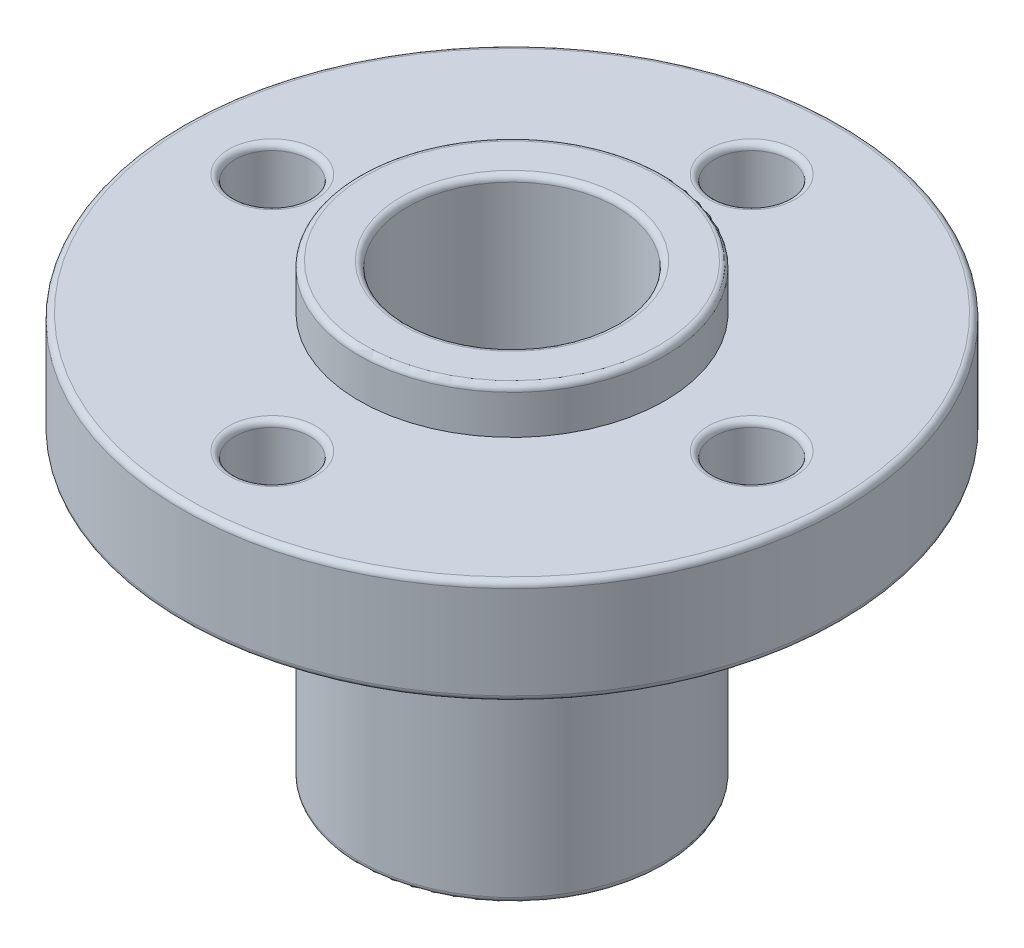
ISO-10303-21;
HEADER;
FILE_DESCRIPTION(('STEP AP214'),'2;1');
FILE_NAME('part.step','',(''),(''),'','','');
FILE_SCHEMA(('AUTOMOTIVE_DESIGN { 1 0 10303 214 1 1 1 1 }'));
ENDSEC;
DATA;
#1=APPLICATION_CONTEXT('core data for automotive mechanical design processes');
#2=APPLICATION_PROTOCOL_DEFINITION('international standard','automotive_design',2000,#1);
#3=PRODUCT_CONTEXT('',#1,'mechanical');
#4=PRODUCT('Part','Part','',(#3));
#5=PRODUCT_RELATED_PRODUCT_CATEGORY('part','',(#4));
#6=PRODUCT_DEFINITION_FORMATION('','',#4);
#7=PRODUCT_DEFINITION_CONTEXT('part definition',#1,'design');
#8=PRODUCT_DEFINITION('design','',#6,#7);
#9=PRODUCT_DEFINITION_SHAPE('','',#8);
#10=(LENGTH_UNIT() NAMED_UNIT(*) SI_UNIT(.MILLI.,.METRE.));
#11=(NAMED_UNIT(*) PLANE_ANGLE_UNIT() SI_UNIT($,.RADIAN.));
#12=(NAMED_UNIT(*) SI_UNIT($,.STERADIAN.) SOLID_ANGLE_UNIT());
#13=UNCERTAINTY_MEASURE_WITH_UNIT(LENGTH_MEASURE(1.E-05),#10,'distance_accuracy_value','');
#14=(GEOMETRIC_REPRESENTATION_CONTEXT(3) GLOBAL_UNCERTAINTY_ASSIGNED_CONTEXT((#13)) GLOBAL_UNIT_ASSIGNED_CONTEXT((#10,
#11,#12)) REPRESENTATION_CONTEXT('',''));
#15=CARTESIAN_POINT('',(0.,0.,0.));
#16=DIRECTION('',(0.,0.,1.));
#17=DIRECTION('',(1.,0.,0.));
#18=AXIS2_PLACEMENT_3D('',#15,#16,#17);
#19=CARTESIAN_POINT('',(5.1,1.74999999999999,0.));
#20=DIRECTION('',(0.,1.,0.));
#21=DIRECTION('',(-1.,0.,0.));
#22=AXIS2_PLACEMENT_3D('',#19,#20,#21);
#23=PLANE('',#22);
#24=CARTESIAN_POINT('',(-8.,1.74999999999995,0.));
#25=DIRECTION('',(0.,1.,0.));
#26=DIRECTION('',(-1.,0.,0.));
#27=AXIS2_PLACEMENT_3D('',#24,#25,#26);
#28=CIRCLE('',#27,1.45);
#29=CARTESIAN_POINT('',(-9.45,1.74999999999994,0.));
#30=VERTEX_POINT('',#29);
#31=EDGE_CURVE('E10',#30,#30,#28,.F.);
#32=ORIENTED_EDGE('',*,*,#31,.T.);
#33=EDGE_LOOP('',(#32));
#34=FACE_BOUND('',#33,.T.);
#35=CARTESIAN_POINT('',(0.,1.74999999999997,7.99999999999994));
#36=DIRECTION('',(0.,1.,0.));
#37=DIRECTION('',(-1.,0.,0.));
#38=AXIS2_PLACEMENT_3D('',#35,#36,#37);
#39=CIRCLE('',#38,1.45);
#40=CARTESIAN_POINT('',(-1.45,1.74999999999997,7.99999999999994));
#41=VERTEX_POINT('',#40);
#42=EDGE_CURVE('E41',#41,#41,#39,.F.);
#43=ORIENTED_EDGE('',*,*,#42,.T.);
#44=EDGE_LOOP('',(#43));
#45=FACE_BOUND('',#44,.T.);
#46=CARTESIAN_POINT('',(8.,1.75,0.));
#47=DIRECTION('',(0.,1.,0.));
#48=DIRECTION('',(-1.,0.,0.));
#49=AXIS2_PLACEMENT_3D('',#46,#47,#48);
#50=CIRCLE('',#49,1.45);
#51=CARTESIAN_POINT('',(6.55,1.75,0.));
#52=VERTEX_POINT('',#51);
#53=EDGE_CURVE('E45',#52,#52,#50,.F.);
#54=ORIENTED_EDGE('',*,*,#53,.T.);
#55=EDGE_LOOP('',(#54));
#56=FACE_BOUND('',#55,.T.);
#57=CARTESIAN_POINT('',(0.,1.74999999999997,-8.00000000000006));
#58=DIRECTION('',(0.,1.,0.));
#59=DIRECTION('',(-1.,0.,0.));
#60=AXIS2_PLACEMENT_3D('',#57,#58,#59);
#61=CIRCLE('',#60,1.45);
#62=CARTESIAN_POINT('',(-1.45,1.74999999999997,-8.00000000000006));
#63=VERTEX_POINT('',#62);
#64=EDGE_CURVE('E49',#63,#63,#61,.F.);
#65=ORIENTED_EDGE('',*,*,#64,.T.);
#66=EDGE_LOOP('',(#65));
#67=FACE_BOUND('',#66,.T.);
#68=CARTESIAN_POINT('',(0.,1.74999999999997,0.));
#69=DIRECTION('',(0.,-1.,0.));
#70=DIRECTION('',(1.,0.,0.));
#71=AXIS2_PLACEMENT_3D('',#68,#69,#70);
#72=CIRCLE('',#71,5.1);
#73=CARTESIAN_POINT('',(5.1,1.74999999999999,0.));
#74=VERTEX_POINT('',#73);
#75=EDGE_CURVE('E129',#74,#74,#72,.T.);
#76=ORIENTED_EDGE('',*,*,#75,.T.);
#77=EDGE_LOOP('',(#76));
#78=FACE_BOUND('',#77,.T.);
#79=CARTESIAN_POINT('',(0.,1.74999999999997,0.));
#80=DIRECTION('',(0.,-1.,0.));
#81=DIRECTION('',(1.,0.,0.));
#82=AXIS2_PLACEMENT_3D('',#79,#80,#81);
#83=CIRCLE('',#82,10.8);
#84=CARTESIAN_POINT('',(10.8,1.75000000000001,0.));
#85=VERTEX_POINT('',#84);
#86=EDGE_CURVE('E90',#85,#85,#83,.T.);
#87=ORIENTED_EDGE('',*,*,#86,.F.);
#88=EDGE_LOOP('',(#87));
#89=FACE_BOUND('',#88,.T.);
#90=ADVANCED_FACE('F34',(#34,#45,#56,#67,#78,#89),#23,.T.);
#91=CARTESIAN_POINT('',(0.,1.54999999999997,0.));
#92=DIRECTION('',(0.,-1.,0.));
#93=DIRECTION('',(1.,0.,0.));
#94=AXIS2_PLACEMENT_3D('',#91,#92,#93);
#95=TOROIDAL_SURFACE('',#94,10.8,0.199999999999998);
#96=ORIENTED_EDGE('',*,*,#86,.T.);
#97=EDGE_LOOP('',(#96));
#98=FACE_BOUND('',#97,.T.);
#99=CARTESIAN_POINT('',(0.,1.54999999999997,0.));
#100=DIRECTION('',(0.,-1.,0.));
#101=DIRECTION('',(1.,0.,0.));
#102=AXIS2_PLACEMENT_3D('',#99,#100,#101);
#103=CIRCLE('',#102,11.);
#104=CARTESIAN_POINT('',(11.,1.55000000000001,0.));
#105=VERTEX_POINT('',#104);
#106=EDGE_CURVE('E93',#105,#105,#103,.T.);
#107=ORIENTED_EDGE('',*,*,#106,.F.);
#108=EDGE_LOOP('',(#107));
#109=FACE_BOUND('',#108,.T.);
#110=ADVANCED_FACE('F152',(#98,#109),#95,.T.);
#111=CARTESIAN_POINT('',(7.33830190770167E-13,-213.929131969293,0.));
#112=DIRECTION('',(0.,-1.,0.));
#113=DIRECTION('',(1.,0.,0.));
#114=AXIS2_PLACEMENT_3D('',#111,#112,#113);
#115=CYLINDRICAL_SURFACE('',#114,11.);
#116=ORIENTED_EDGE('',*,*,#106,.T.);
#117=EDGE_LOOP('',(#116));
#118=FACE_BOUND('',#117,.T.);
#119=CARTESIAN_POINT('',(0.,-1.55000000000002,0.));
#120=DIRECTION('',(0.,-1.,0.));
#121=DIRECTION('',(1.,0.,0.));
#122=AXIS2_PLACEMENT_3D('',#119,#120,#121);
#123=CIRCLE('',#122,11.);
#124=CARTESIAN_POINT('',(11.,-1.54999999999999,0.));
#125=VERTEX_POINT('',#124);
#126=EDGE_CURVE('E96',#125,#125,#123,.T.);
#127=ORIENTED_EDGE('',*,*,#126,.F.);
#128=EDGE_LOOP('',(#127));
#129=FACE_BOUND('',#128,.T.);
#130=ADVANCED_FACE('F157',(#118,#129),#115,.T.);
#131=CARTESIAN_POINT('',(0.,-1.55000000000003,0.));
#132=DIRECTION('',(0.,-1.,0.));
#133=DIRECTION('',(1.,0.,0.));
#134=AXIS2_PLACEMENT_3D('',#131,#132,#133);
#135=TOROIDAL_SURFACE('',#134,10.8,0.199999999999998);
#136=ORIENTED_EDGE('',*,*,#126,.T.);
#137=EDGE_LOOP('',(#136));
#138=FACE_BOUND('',#137,.T.);
#139=CARTESIAN_POINT('',(0.,-1.75000000000003,0.));
#140=DIRECTION('',(0.,-1.,0.));
#141=DIRECTION('',(1.,0.,0.));
#142=AXIS2_PLACEMENT_3D('',#139,#140,#141);
#143=CIRCLE('',#142,10.8);
#144=CARTESIAN_POINT('',(10.8,-1.74999999999999,0.));
#145=VERTEX_POINT('',#144);
#146=EDGE_CURVE('E99',#145,#145,#143,.T.);
#147=ORIENTED_EDGE('',*,*,#146,.F.);
#148=EDGE_LOOP('',(#147));
#149=FACE_BOUND('',#148,.T.);
#150=ADVANCED_FACE('F222',(#138,#149),#135,.T.);
#151=CARTESIAN_POINT('',(10.8,-1.74999999999999,0.));
#152=DIRECTION('',(0.,-1.,0.));
#153=DIRECTION('',(1.,0.,0.));
#154=AXIS2_PLACEMENT_3D('',#151,#152,#153);
#155=PLANE('',#154);
#156=CARTESIAN_POINT('',(-7.99999999999999,-1.75000000000005,0.));
#157=DIRECTION('',(0.,-1.,0.));
#158=DIRECTION('',(1.,0.,0.));
#159=AXIS2_PLACEMENT_3D('',#156,#157,#158);
#160=CIRCLE('',#159,1.45);
#161=CARTESIAN_POINT('',(-6.54999999999999,-1.75000000000005,0.));
#162=VERTEX_POINT('',#161);
#163=EDGE_CURVE('E78',#162,#162,#160,.F.);
#164=ORIENTED_EDGE('',*,*,#163,.T.);
#165=EDGE_LOOP('',(#164));
#166=FACE_BOUND('',#165,.T.);
#167=CARTESIAN_POINT('',(0.,-1.75000000000003,7.99999999999994));
#168=DIRECTION('',(0.,-1.,0.));
#169=DIRECTION('',(1.,0.,0.));
#170=AXIS2_PLACEMENT_3D('',#167,#168,#169);
#171=CIRCLE('',#170,1.45);
#172=CARTESIAN_POINT('',(1.45000000000001,-1.75000000000002,7.99999999999994));
#173=VERTEX_POINT('',#172);
#174=EDGE_CURVE('E81',#173,#173,#171,.F.);
#175=ORIENTED_EDGE('',*,*,#174,.T.);
#176=EDGE_LOOP('',(#175));
#177=FACE_BOUND('',#176,.T.);
#178=CARTESIAN_POINT('',(8.00000000000001,-1.75,0.));
#179=DIRECTION('',(0.,-1.,0.));
#180=DIRECTION('',(1.,0.,0.));
#181=AXIS2_PLACEMENT_3D('',#178,#179,#180);
#182=CIRCLE('',#181,1.45);
#183=CARTESIAN_POINT('',(9.45000000000001,-1.75,0.));
#184=VERTEX_POINT('',#183);
#185=EDGE_CURVE('E84',#184,#184,#182,.F.);
#186=ORIENTED_EDGE('',*,*,#185,.T.);
#187=EDGE_LOOP('',(#186));
#188=FACE_BOUND('',#187,.T.);
#189=CARTESIAN_POINT('',(0.,-1.75000000000003,-8.00000000000006));
#190=DIRECTION('',(0.,-1.,0.));
#191=DIRECTION('',(1.,0.,0.));
#192=AXIS2_PLACEMENT_3D('',#189,#190,#191);
#193=CIRCLE('',#192,1.45);
#194=CARTESIAN_POINT('',(1.45000000000001,-1.75000000000002,-8.00000000000006));
#195=VERTEX_POINT('',#194);
#196=EDGE_CURVE('E87',#195,#195,#193,.F.);
#197=ORIENTED_EDGE('',*,*,#196,.T.);
#198=EDGE_LOOP('',(#197));
#199=FACE_BOUND('',#198,.T.);
#200=ORIENTED_EDGE('',*,*,#146,.T.);
#201=EDGE_LOOP('',(#200));
#202=FACE_BOUND('',#201,.T.);
#203=CARTESIAN_POINT('',(0.,-1.75000000000003,0.));
#204=DIRECTION('',(0.,-1.,0.));
#205=DIRECTION('',(1.,0.,0.));
#206=AXIS2_PLACEMENT_3D('',#203,#204,#205);
#207=CIRCLE('',#206,5.09999999999999);
#208=CARTESIAN_POINT('',(5.1,-1.75000000000001,0.));
#209=VERTEX_POINT('',#208);
#210=EDGE_CURVE('E102',#209,#209,#207,.T.);
#211=ORIENTED_EDGE('',*,*,#210,.F.);
#212=EDGE_LOOP('',(#211));
#213=FACE_BOUND('',#212,.T.);
#214=ADVANCED_FACE('F218',(#166,#177,#188,#199,#202,#213),#155,.T.);
#215=CARTESIAN_POINT('',(7.33830190770167E-13,-213.929131969293,0.));
#216=DIRECTION('',(0.,-1.,0.));
#217=DIRECTION('',(1.,0.,0.));
#218=AXIS2_PLACEMENT_3D('',#215,#216,#217);
#219=CYLINDRICAL_SURFACE('',#218,5.09999999999998);
#220=ORIENTED_EDGE('',*,*,#210,.T.);
#221=EDGE_LOOP('',(#220));
#222=FACE_BOUND('',#221,.T.);
#223=CARTESIAN_POINT('',(0.,-11.55,0.));
#224=DIRECTION('',(0.,-1.,0.));
#225=DIRECTION('',(1.,0.,0.));
#226=AXIS2_PLACEMENT_3D('',#223,#224,#225);
#227=CIRCLE('',#226,5.09999999999996);
#228=CARTESIAN_POINT('',(5.1,-11.55,0.));
#229=VERTEX_POINT('',#228);
#230=EDGE_CURVE('E105',#229,#229,#227,.T.);
#231=ORIENTED_EDGE('',*,*,#230,.F.);
#232=EDGE_LOOP('',(#231));
#233=FACE_BOUND('',#232,.T.);
#234=ADVANCED_FACE('F221',(#222,#233),#219,.T.);
#235=CARTESIAN_POINT('',(0.,-11.55,0.));
#236=DIRECTION('',(0.,-1.,0.));
#237=DIRECTION('',(1.,0.,0.));
#238=AXIS2_PLACEMENT_3D('',#235,#236,#237);
#239=TOROIDAL_SURFACE('',#238,4.89999999999996,0.2);
#240=ORIENTED_EDGE('',*,*,#230,.T.);
#241=EDGE_LOOP('',(#240));
#242=FACE_BOUND('',#241,.T.);
#243=CARTESIAN_POINT('',(0.,-11.75,0.));
#244=DIRECTION('',(0.,-1.,0.));
#245=DIRECTION('',(1.,0.,0.));
#246=AXIS2_PLACEMENT_3D('',#243,#244,#245);
#247=CIRCLE('',#246,4.89999999999996);
#248=CARTESIAN_POINT('',(4.9,-11.75,0.));
#249=VERTEX_POINT('',#248);
#250=EDGE_CURVE('E108',#249,#249,#247,.T.);
#251=ORIENTED_EDGE('',*,*,#250,.F.);
#252=EDGE_LOOP('',(#251));
#253=FACE_BOUND('',#252,.T.);
#254=ADVANCED_FACE('F236',(#242,#253),#239,.T.);
#255=CARTESIAN_POINT('',(4.9,-11.75,0.));
#256=DIRECTION('',(0.,-1.,0.));
#257=DIRECTION('',(1.,0.,0.));
#258=AXIS2_PLACEMENT_3D('',#255,#256,#257);
#259=PLANE('',#258);
#260=ORIENTED_EDGE('',*,*,#250,.T.);
#261=EDGE_LOOP('',(#260));
#262=FACE_BOUND('',#261,.T.);
#263=CARTESIAN_POINT('',(0.,-11.75,0.));
#264=DIRECTION('',(0.,-1.,0.));
#265=DIRECTION('',(1.,0.,0.));
#266=AXIS2_PLACEMENT_3D('',#263,#264,#265);
#267=CIRCLE('',#266,3.69999999999996);
#268=CARTESIAN_POINT('',(3.7,-11.75,0.));
#269=VERTEX_POINT('',#268);
#270=EDGE_CURVE('E111',#269,#269,#267,.T.);
#271=ORIENTED_EDGE('',*,*,#270,.F.);
#272=EDGE_LOOP('',(#271));
#273=FACE_BOUND('',#272,.T.);
#274=ADVANCED_FACE('F242',(#262,#273),#259,.T.);
#275=CARTESIAN_POINT('',(0.,-11.55,0.));
#276=DIRECTION('',(0.,-1.,0.));
#277=DIRECTION('',(1.,0.,0.));
#278=AXIS2_PLACEMENT_3D('',#275,#276,#277);
#279=TOROIDAL_SURFACE('',#278,3.69999999999996,0.2);
#280=ORIENTED_EDGE('',*,*,#270,.T.);
#281=EDGE_LOOP('',(#280));
#282=FACE_BOUND('',#281,.T.);
#283=CARTESIAN_POINT('',(0.,-11.55,0.));
#284=DIRECTION('',(0.,-1.,0.));
#285=DIRECTION('',(1.,0.,0.));
#286=AXIS2_PLACEMENT_3D('',#283,#284,#285);
#287=CIRCLE('',#286,3.49999999999996);
#288=CARTESIAN_POINT('',(3.5,-11.55,0.));
#289=VERTEX_POINT('',#288);
#290=EDGE_CURVE('E114',#289,#289,#287,.T.);
#291=ORIENTED_EDGE('',*,*,#290,.F.);
#292=EDGE_LOOP('',(#291));
#293=FACE_BOUND('',#292,.T.);
#294=ADVANCED_FACE('F248',(#282,#293),#279,.T.);
#295=CARTESIAN_POINT('',(7.33830190770167E-13,-213.929131969293,0.));
#296=DIRECTION('',(0.,-1.,0.));
#297=DIRECTION('',(1.,0.,0.));
#298=AXIS2_PLACEMENT_3D('',#295,#296,#297);
#299=CYLINDRICAL_SURFACE('',#298,3.49999999999999);
#300=ORIENTED_EDGE('',*,*,#290,.T.);
#301=EDGE_LOOP('',(#300));
#302=FACE_BOUND('',#301,.T.);
#303=CARTESIAN_POINT('',(0.,3.05,0.));
#304=DIRECTION('',(0.,-1.,0.));
#305=DIRECTION('',(1.,0.,0.));
#306=AXIS2_PLACEMENT_3D('',#303,#304,#305);
#307=CIRCLE('',#306,3.50000000000001);
#308=CARTESIAN_POINT('',(3.5,3.05000000000001,0.));
#309=VERTEX_POINT('',#308);
#310=EDGE_CURVE('E117',#309,#309,#307,.T.);
#311=ORIENTED_EDGE('',*,*,#310,.F.);
#312=EDGE_LOOP('',(#311));
#313=FACE_BOUND('',#312,.T.);
#314=ADVANCED_FACE('F254',(#302,#313),#299,.F.);
#315=CARTESIAN_POINT('',(0.,3.05,0.));
#316=DIRECTION('',(0.,-1.,0.));
#317=DIRECTION('',(1.,0.,0.));
#318=AXIS2_PLACEMENT_3D('',#315,#316,#317);
#319=TOROIDAL_SURFACE('',#318,3.70000000000001,0.2);
#320=ORIENTED_EDGE('',*,*,#310,.T.);
#321=EDGE_LOOP('',(#320));
#322=FACE_BOUND('',#321,.T.);
#323=CARTESIAN_POINT('',(0.,3.25,0.));
#324=DIRECTION('',(0.,-1.,0.));
#325=DIRECTION('',(1.,0.,0.));
#326=AXIS2_PLACEMENT_3D('',#323,#324,#325);
#327=CIRCLE('',#326,3.70000000000001);
#328=CARTESIAN_POINT('',(3.7,3.25000000000002,0.));
#329=VERTEX_POINT('',#328);
#330=EDGE_CURVE('E120',#329,#329,#327,.T.);
#331=ORIENTED_EDGE('',*,*,#330,.F.);
#332=EDGE_LOOP('',(#331));
#333=FACE_BOUND('',#332,.T.);
#334=ADVANCED_FACE('F260',(#322,#333),#319,.T.);
#335=CARTESIAN_POINT('',(3.7,3.25,0.));
#336=DIRECTION('',(0.,1.,0.));
#337=DIRECTION('',(-1.,0.,0.));
#338=AXIS2_PLACEMENT_3D('',#335,#336,#337);
#339=PLANE('',#338);
#340=ORIENTED_EDGE('',*,*,#330,.T.);
#341=EDGE_LOOP('',(#340));
#342=FACE_BOUND('',#341,.T.);
#343=CARTESIAN_POINT('',(0.,3.24999999999998,0.));
#344=DIRECTION('',(0.,-1.,0.));
#345=DIRECTION('',(1.,0.,0.));
#346=AXIS2_PLACEMENT_3D('',#343,#344,#345);
#347=CIRCLE('',#346,4.90000000000001);
#348=CARTESIAN_POINT('',(4.9,3.24999999999999,0.));
#349=VERTEX_POINT('',#348);
#350=EDGE_CURVE('E123',#349,#349,#347,.T.);
#351=ORIENTED_EDGE('',*,*,#350,.F.);
#352=EDGE_LOOP('',(#351));
#353=FACE_BOUND('',#352,.T.);
#354=ADVANCED_FACE('F148',(#342,#353),#339,.T.);
#355=CARTESIAN_POINT('',(0.,3.04999999999997,0.));
#356=DIRECTION('',(0.,-1.,0.));
#357=DIRECTION('',(1.,0.,0.));
#358=AXIS2_PLACEMENT_3D('',#355,#356,#357);
#359=TOROIDAL_SURFACE('',#358,4.90000000000001,0.199999999999999);
#360=ORIENTED_EDGE('',*,*,#350,.T.);
#361=EDGE_LOOP('',(#360));
#362=FACE_BOUND('',#361,.T.);
#363=CARTESIAN_POINT('',(0.,3.04999999999997,0.));
#364=DIRECTION('',(0.,-1.,0.));
#365=DIRECTION('',(1.,0.,0.));
#366=AXIS2_PLACEMENT_3D('',#363,#364,#365);
#367=CIRCLE('',#366,5.10000000000001);
#368=CARTESIAN_POINT('',(5.1,3.04999999999999,0.));
#369=VERTEX_POINT('',#368);
#370=EDGE_CURVE('E126',#369,#369,#367,.T.);
#371=ORIENTED_EDGE('',*,*,#370,.F.);
#372=EDGE_LOOP('',(#371));
#373=FACE_BOUND('',#372,.T.);
#374=ADVANCED_FACE('F138',(#362,#373),#359,.T.);
#375=CARTESIAN_POINT('',(7.33830190770167E-13,-213.929131969293,0.));
#376=DIRECTION('',(0.,-1.,0.));
#377=DIRECTION('',(1.,0.,0.));
#378=AXIS2_PLACEMENT_3D('',#375,#376,#377);
#379=CYLINDRICAL_SURFACE('',#378,5.10000000000001);
#380=ORIENTED_EDGE('',*,*,#370,.T.);
#381=EDGE_LOOP('',(#380));
#382=FACE_BOUND('',#381,.T.);
#383=ORIENTED_EDGE('',*,*,#75,.F.);
#384=EDGE_LOOP('',(#383));
#385=FACE_BOUND('',#384,.T.);
#386=ADVANCED_FACE('F135',(#382,#385),#379,.T.);
#387=CARTESIAN_POINT('',(0.,-11.7510000000001,-8.00000000000006));
#388=DIRECTION('',(0.,1.,0.));
#389=DIRECTION('',(-1.,0.,0.));
#390=AXIS2_PLACEMENT_3D('',#387,#388,#389);
#391=CYLINDRICAL_SURFACE('',#390,1.25);
#392=CARTESIAN_POINT('',(0.,-1.55000000000003,-8.00000000000006));
#393=DIRECTION('',(0.,-1.,0.));
#394=DIRECTION('',(1.,0.,0.));
#395=AXIS2_PLACEMENT_3D('',#392,#393,#394);
#396=CIRCLE('',#395,1.25);
#397=CARTESIAN_POINT('',(1.25000000000001,-1.55000000000002,-8.00000000000006));
#398=VERTEX_POINT('',#397);
#399=EDGE_CURVE('E54',#398,#398,#396,.T.);
#400=ORIENTED_EDGE('',*,*,#399,.T.);
#401=EDGE_LOOP('',(#400));
#402=FACE_BOUND('',#401,.T.);
#403=CARTESIAN_POINT('',(0.,1.54999999999997,-8.00000000000006));
#404=DIRECTION('',(0.,1.,0.));
#405=DIRECTION('',(-1.,0.,0.));
#406=AXIS2_PLACEMENT_3D('',#403,#404,#405);
#407=CIRCLE('',#406,1.25);
#408=CARTESIAN_POINT('',(-1.25,1.54999999999997,-8.00000000000006));
#409=VERTEX_POINT('',#408);
#410=EDGE_CURVE('E57',#409,#409,#407,.T.);
#411=ORIENTED_EDGE('',*,*,#410,.T.);
#412=EDGE_LOOP('',(#411));
#413=FACE_BOUND('',#412,.T.);
#414=ADVANCED_FACE('F137',(#402,#413),#391,.F.);
#415=CARTESIAN_POINT('',(-7.99999999999995,-11.7510000000001,0.));
#416=DIRECTION('',(0.,1.,0.));
#417=DIRECTION('',(-1.,0.,0.));
#418=AXIS2_PLACEMENT_3D('',#415,#416,#417);
#419=CYLINDRICAL_SURFACE('',#418,1.25);
#420=CARTESIAN_POINT('',(-7.99999999999999,-1.55000000000005,0.));
#421=DIRECTION('',(0.,-1.,0.));
#422=DIRECTION('',(1.,0.,0.));
#423=AXIS2_PLACEMENT_3D('',#420,#421,#422);
#424=CIRCLE('',#423,1.25);
#425=CARTESIAN_POINT('',(-6.74999999999999,-1.55000000000005,0.));
#426=VERTEX_POINT('',#425);
#427=EDGE_CURVE('E72',#426,#426,#424,.T.);
#428=ORIENTED_EDGE('',*,*,#427,.T.);
#429=EDGE_LOOP('',(#428));
#430=FACE_BOUND('',#429,.T.);
#431=CARTESIAN_POINT('',(-8.,1.54999999999994,0.));
#432=DIRECTION('',(0.,1.,0.));
#433=DIRECTION('',(-1.,0.,0.));
#434=AXIS2_PLACEMENT_3D('',#431,#432,#433);
#435=CIRCLE('',#434,1.25);
#436=CARTESIAN_POINT('',(-9.25,1.54999999999994,0.));
#437=VERTEX_POINT('',#436);
#438=EDGE_CURVE('E75',#437,#437,#435,.T.);
#439=ORIENTED_EDGE('',*,*,#438,.T.);
#440=EDGE_LOOP('',(#439));
#441=FACE_BOUND('',#440,.T.);
#442=ADVANCED_FACE('F145',(#430,#441),#419,.F.);
#443=CARTESIAN_POINT('',(0.,-11.7510000000001,7.99999999999994));
#444=DIRECTION('',(0.,1.,0.));
#445=DIRECTION('',(-1.,0.,0.));
#446=AXIS2_PLACEMENT_3D('',#443,#444,#445);
#447=CYLINDRICAL_SURFACE('',#446,1.25);
#448=CARTESIAN_POINT('',(0.,-1.55000000000003,7.99999999999994));
#449=DIRECTION('',(0.,-1.,0.));
#450=DIRECTION('',(1.,0.,0.));
#451=AXIS2_PLACEMENT_3D('',#448,#449,#450);
#452=CIRCLE('',#451,1.25);
#453=CARTESIAN_POINT('',(1.25000000000001,-1.55000000000002,7.99999999999994));
#454=VERTEX_POINT('',#453);
#455=EDGE_CURVE('E66',#454,#454,#452,.T.);
#456=ORIENTED_EDGE('',*,*,#455,.T.);
#457=EDGE_LOOP('',(#456));
#458=FACE_BOUND('',#457,.T.);
#459=CARTESIAN_POINT('',(0.,1.54999999999997,7.99999999999994));
#460=DIRECTION('',(0.,1.,0.));
#461=DIRECTION('',(-1.,0.,0.));
#462=AXIS2_PLACEMENT_3D('',#459,#460,#461);
#463=CIRCLE('',#462,1.25);
#464=CARTESIAN_POINT('',(-1.25,1.54999999999997,7.99999999999994));
#465=VERTEX_POINT('',#464);
#466=EDGE_CURVE('E69',#465,#465,#463,.T.);
#467=ORIENTED_EDGE('',*,*,#466,.T.);
#468=EDGE_LOOP('',(#467));
#469=FACE_BOUND('',#468,.T.);
#470=ADVANCED_FACE('F198',(#458,#469),#447,.F.);
#471=CARTESIAN_POINT('',(8.00000000000005,-11.751,0.));
#472=DIRECTION('',(0.,1.,0.));
#473=DIRECTION('',(-1.,0.,0.));
#474=AXIS2_PLACEMENT_3D('',#471,#472,#473);
#475=CYLINDRICAL_SURFACE('',#474,1.25);
#476=CARTESIAN_POINT('',(8.00000000000001,-1.55,0.));
#477=DIRECTION('',(0.,-1.,0.));
#478=DIRECTION('',(1.,0.,0.));
#479=AXIS2_PLACEMENT_3D('',#476,#477,#478);
#480=CIRCLE('',#479,1.25);
#481=CARTESIAN_POINT('',(9.25000000000001,-1.55,0.));
#482=VERTEX_POINT('',#481);
#483=EDGE_CURVE('E60',#482,#482,#480,.T.);
#484=ORIENTED_EDGE('',*,*,#483,.T.);
#485=EDGE_LOOP('',(#484));
#486=FACE_BOUND('',#485,.T.);
#487=CARTESIAN_POINT('',(8.,1.55,0.));
#488=DIRECTION('',(0.,1.,0.));
#489=DIRECTION('',(-1.,0.,0.));
#490=AXIS2_PLACEMENT_3D('',#487,#488,#489);
#491=CIRCLE('',#490,1.25);
#492=CARTESIAN_POINT('',(6.75,1.55,0.));
#493=VERTEX_POINT('',#492);
#494=EDGE_CURVE('E63',#493,#493,#491,.T.);
#495=ORIENTED_EDGE('',*,*,#494,.T.);
#496=EDGE_LOOP('',(#495));
#497=FACE_BOUND('',#496,.T.);
#498=ADVANCED_FACE('F166',(#486,#497),#475,.F.);
#499=CARTESIAN_POINT('',(-7.99999999999999,-1.55000000000005,0.));
#500=DIRECTION('',(0.,-1.,0.));
#501=DIRECTION('',(1.,0.,0.));
#502=AXIS2_PLACEMENT_3D('',#499,#500,#501);
#503=TOROIDAL_SURFACE('',#502,1.45,0.2);
#504=ORIENTED_EDGE('',*,*,#427,.F.);
#505=EDGE_LOOP('',(#504));
#506=FACE_BOUND('',#505,.T.);
#507=ORIENTED_EDGE('',*,*,#163,.F.);
#508=EDGE_LOOP('',(#507));
#509=FACE_BOUND('',#508,.T.);
#510=ADVANCED_FACE('F162',(#506,#509),#503,.T.);
#511=CARTESIAN_POINT('',(0.,-1.55000000000003,7.99999999999994));
#512=DIRECTION('',(0.,-1.,0.));
#513=DIRECTION('',(1.,0.,0.));
#514=AXIS2_PLACEMENT_3D('',#511,#512,#513);
#515=TOROIDAL_SURFACE('',#514,1.45,0.2);
#516=ORIENTED_EDGE('',*,*,#455,.F.);
#517=EDGE_LOOP('',(#516));
#518=FACE_BOUND('',#517,.T.);
#519=ORIENTED_EDGE('',*,*,#174,.F.);
#520=EDGE_LOOP('',(#519));
#521=FACE_BOUND('',#520,.T.);
#522=ADVANCED_FACE('F165',(#518,#521),#515,.T.);
#523=CARTESIAN_POINT('',(8.00000000000001,-1.55,0.));
#524=DIRECTION('',(0.,-1.,0.));
#525=DIRECTION('',(1.,0.,0.));
#526=AXIS2_PLACEMENT_3D('',#523,#524,#525);
#527=TOROIDAL_SURFACE('',#526,1.45,0.2);
#528=ORIENTED_EDGE('',*,*,#483,.F.);
#529=EDGE_LOOP('',(#528));
#530=FACE_BOUND('',#529,.T.);
#531=ORIENTED_EDGE('',*,*,#185,.F.);
#532=EDGE_LOOP('',(#531));
#533=FACE_BOUND('',#532,.T.);
#534=ADVANCED_FACE('F170',(#530,#533),#527,.T.);
#535=CARTESIAN_POINT('',(0.,-1.55000000000003,-8.00000000000006));
#536=DIRECTION('',(0.,-1.,0.));
#537=DIRECTION('',(1.,0.,0.));
#538=AXIS2_PLACEMENT_3D('',#535,#536,#537);
#539=TOROIDAL_SURFACE('',#538,1.45,0.2);
#540=ORIENTED_EDGE('',*,*,#399,.F.);
#541=EDGE_LOOP('',(#540));
#542=FACE_BOUND('',#541,.T.);
#543=ORIENTED_EDGE('',*,*,#196,.F.);
#544=EDGE_LOOP('',(#543));
#545=FACE_BOUND('',#544,.T.);
#546=ADVANCED_FACE('F174',(#542,#545),#539,.T.);
#547=CARTESIAN_POINT('',(-8.,1.54999999999995,0.));
#548=DIRECTION('',(0.,1.,0.));
#549=DIRECTION('',(-1.,0.,0.));
#550=AXIS2_PLACEMENT_3D('',#547,#548,#549);
#551=TOROIDAL_SURFACE('',#550,1.45,0.2);
#552=ORIENTED_EDGE('',*,*,#31,.F.);
#553=EDGE_LOOP('',(#552));
#554=FACE_BOUND('',#553,.T.);
#555=ORIENTED_EDGE('',*,*,#438,.F.);
#556=EDGE_LOOP('',(#555));
#557=FACE_BOUND('',#556,.T.);
#558=ADVANCED_FACE('F178',(#554,#557),#551,.T.);
#559=CARTESIAN_POINT('',(0.,1.54999999999997,7.99999999999994));
#560=DIRECTION('',(0.,1.,0.));
#561=DIRECTION('',(-1.,0.,0.));
#562=AXIS2_PLACEMENT_3D('',#559,#560,#561);
#563=TOROIDAL_SURFACE('',#562,1.45,0.2);
#564=ORIENTED_EDGE('',*,*,#42,.F.);
#565=EDGE_LOOP('',(#564));
#566=FACE_BOUND('',#565,.T.);
#567=ORIENTED_EDGE('',*,*,#466,.F.);
#568=EDGE_LOOP('',(#567));
#569=FACE_BOUND('',#568,.T.);
#570=ADVANCED_FACE('F182',(#566,#569),#563,.T.);
#571=CARTESIAN_POINT('',(8.,1.55,0.));
#572=DIRECTION('',(0.,1.,0.));
#573=DIRECTION('',(-1.,0.,0.));
#574=AXIS2_PLACEMENT_3D('',#571,#572,#573);
#575=TOROIDAL_SURFACE('',#574,1.45,0.2);
#576=ORIENTED_EDGE('',*,*,#53,.F.);
#577=EDGE_LOOP('',(#576));
#578=FACE_BOUND('',#577,.T.);
#579=ORIENTED_EDGE('',*,*,#494,.F.);
#580=EDGE_LOOP('',(#579));
#581=FACE_BOUND('',#580,.T.);
#582=ADVANCED_FACE('F185',(#578,#581),#575,.T.);
#583=CARTESIAN_POINT('',(0.,1.54999999999997,-8.00000000000006));
#584=DIRECTION('',(0.,1.,0.));
#585=DIRECTION('',(-1.,0.,0.));
#586=AXIS2_PLACEMENT_3D('',#583,#584,#585);
#587=TOROIDAL_SURFACE('',#586,1.45,0.2);
#588=ORIENTED_EDGE('',*,*,#64,.F.);
#589=EDGE_LOOP('',(#588));
#590=FACE_BOUND('',#589,.T.);
#591=ORIENTED_EDGE('',*,*,#410,.F.);
#592=EDGE_LOOP('',(#591));
#593=FACE_BOUND('',#592,.T.);
#594=ADVANCED_FACE('F36',(#590,#593),#587,.T.);
#595=CLOSED_SHELL('',(#90,#110,#130,#150,#214,#234,#254,#274,#294,#314,#334,#354,#374,#386,#414,
#442,#470,#498,#510,#522,#534,#546,#558,#570,#582,#594));
#596=MANIFOLD_SOLID_BREP('B2',#595);
#597=ADVANCED_BREP_SHAPE_REPRESENTATION('',(#18,#596),#14);
#598=SHAPE_DEFINITION_REPRESENTATION(#9,#597);
ENDSEC;
END-ISO-10303-21;
